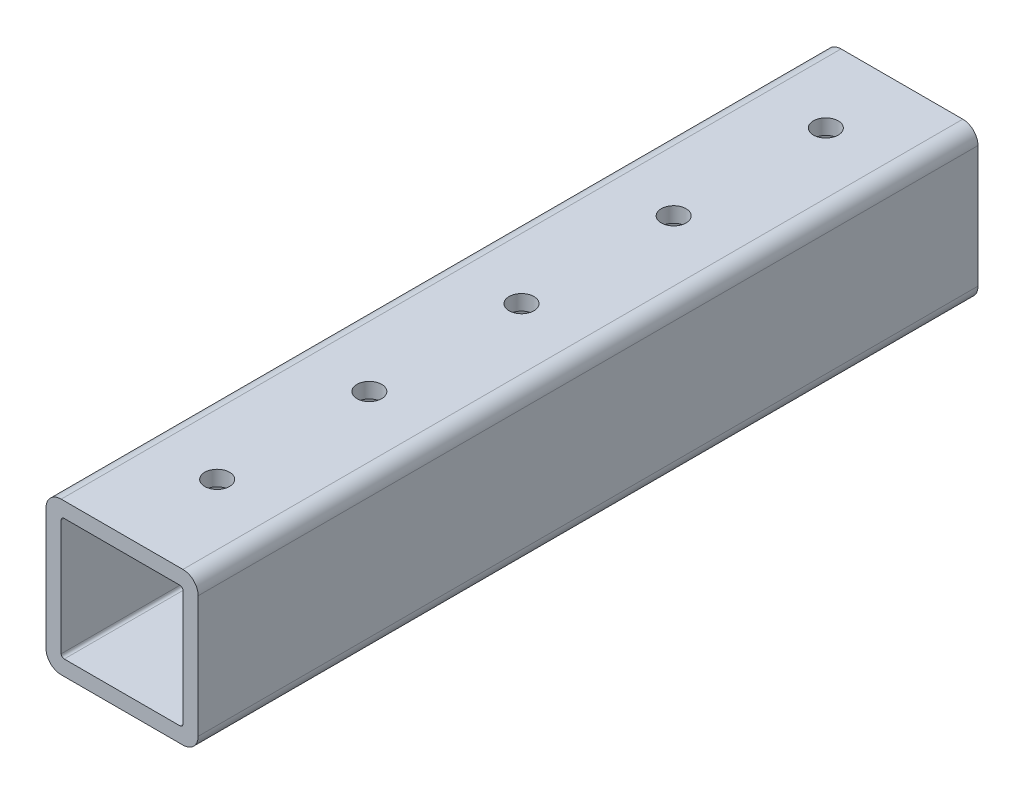
ISO-10303-21;
HEADER;
FILE_DESCRIPTION(('STEP AP214'),'2;1');
FILE_NAME('part.step','',(''),(''),'','','');
FILE_SCHEMA(('AUTOMOTIVE_DESIGN { 1 0 10303 214 1 1 1 1 }'));
ENDSEC;
DATA;
#1=APPLICATION_CONTEXT('core data for automotive mechanical design processes');
#2=APPLICATION_PROTOCOL_DEFINITION('international standard','automotive_design',2000,#1);
#3=PRODUCT_CONTEXT('',#1,'mechanical');
#4=PRODUCT('Part','Part','',(#3));
#5=PRODUCT_RELATED_PRODUCT_CATEGORY('part','',(#4));
#6=PRODUCT_DEFINITION_FORMATION('','',#4);
#7=PRODUCT_DEFINITION_CONTEXT('part definition',#1,'design');
#8=PRODUCT_DEFINITION('design','',#6,#7);
#9=PRODUCT_DEFINITION_SHAPE('','',#8);
#10=(LENGTH_UNIT() NAMED_UNIT(*) SI_UNIT(.MILLI.,.METRE.));
#11=(NAMED_UNIT(*) PLANE_ANGLE_UNIT() SI_UNIT($,.RADIAN.));
#12=(NAMED_UNIT(*) SI_UNIT($,.STERADIAN.) SOLID_ANGLE_UNIT());
#13=UNCERTAINTY_MEASURE_WITH_UNIT(LENGTH_MEASURE(1.E-05),#10,'distance_accuracy_value','');
#14=(GEOMETRIC_REPRESENTATION_CONTEXT(3) GLOBAL_UNCERTAINTY_ASSIGNED_CONTEXT((#13)) GLOBAL_UNIT_ASSIGNED_CONTEXT((#10,
#11,#12)) REPRESENTATION_CONTEXT('',''));
#15=CARTESIAN_POINT('',(0.,0.,0.));
#16=DIRECTION('',(0.,0.,1.));
#17=DIRECTION('',(1.,0.,0.));
#18=AXIS2_PLACEMENT_3D('',#15,#16,#17);
#19=CARTESIAN_POINT('',(0.,0.,269.875000000006));
#20=DIRECTION('',(0.,0.,1.));
#21=DIRECTION('',(1.,0.,0.));
#22=AXIS2_PLACEMENT_3D('',#19,#20,#21);
#23=PLANE('',#22);
#24=DIRECTION('',(-1.,0.,0.));
#25=VECTOR('',#24,1.);
#26=CARTESIAN_POINT('',(-10.16,10.16,269.875000000006));
#27=LINE('',#26,#25);
#28=CARTESIAN_POINT('',(9.66,10.16,269.875000000006));
#29=VERTEX_POINT('',#28);
#30=CARTESIAN_POINT('',(-9.65999999999999,10.16,269.875000000006));
#31=VERTEX_POINT('',#30);
#32=EDGE_CURVE('E206',#29,#31,#27,.T.);
#33=ORIENTED_EDGE('',*,*,#32,.F.);
#34=CARTESIAN_POINT('',(9.66,9.65999999999999,269.875000000006));
#35=DIRECTION('',(0.,0.,1.));
#36=DIRECTION('',(1.,0.,0.));
#37=AXIS2_PLACEMENT_3D('',#34,#35,#36);
#38=CIRCLE('',#37,0.5);
#39=CARTESIAN_POINT('',(10.16,9.65999999999999,269.875000000006));
#40=VERTEX_POINT('',#39);
#41=EDGE_CURVE('E202',#29,#40,#38,.F.);
#42=ORIENTED_EDGE('',*,*,#41,.T.);
#43=DIRECTION('',(0.,1.,0.));
#44=VECTOR('',#43,1.);
#45=CARTESIAN_POINT('',(10.16,-10.16,269.875000000006));
#46=LINE('',#45,#44);
#47=CARTESIAN_POINT('',(10.16,-9.66,269.875000000006));
#48=VERTEX_POINT('',#47);
#49=EDGE_CURVE('E195',#48,#40,#46,.T.);
#50=ORIENTED_EDGE('',*,*,#49,.F.);
#51=CARTESIAN_POINT('',(9.66,-9.66,269.875000000006));
#52=DIRECTION('',(0.,0.,1.));
#53=DIRECTION('',(1.,0.,0.));
#54=AXIS2_PLACEMENT_3D('',#51,#52,#53);
#55=CIRCLE('',#54,0.5);
#56=CARTESIAN_POINT('',(9.66,-10.16,269.875000000006));
#57=VERTEX_POINT('',#56);
#58=EDGE_CURVE('E191',#48,#57,#55,.F.);
#59=ORIENTED_EDGE('',*,*,#58,.T.);
#60=DIRECTION('',(1.,0.,0.));
#61=VECTOR('',#60,1.);
#62=CARTESIAN_POINT('',(-10.16,-10.16,269.875000000006));
#63=LINE('',#62,#61);
#64=CARTESIAN_POINT('',(-9.65999999999999,-10.16,269.875000000006));
#65=VERTEX_POINT('',#64);
#66=EDGE_CURVE('E187',#65,#57,#63,.T.);
#67=ORIENTED_EDGE('',*,*,#66,.F.);
#68=CARTESIAN_POINT('',(-9.65999999999999,-9.66,269.875000000006));
#69=DIRECTION('',(0.,0.,1.));
#70=DIRECTION('',(1.,0.,0.));
#71=AXIS2_PLACEMENT_3D('',#68,#69,#70);
#72=CIRCLE('',#71,0.5);
#73=CARTESIAN_POINT('',(-10.16,-9.66,269.875000000006));
#74=VERTEX_POINT('',#73);
#75=EDGE_CURVE('E193',#65,#74,#72,.F.);
#76=ORIENTED_EDGE('',*,*,#75,.T.);
#77=DIRECTION('',(0.,-1.,0.));
#78=VECTOR('',#77,1.);
#79=CARTESIAN_POINT('',(-10.16,-10.16,269.875000000006));
#80=LINE('',#79,#78);
#81=CARTESIAN_POINT('',(-10.16,9.66,269.875000000006));
#82=VERTEX_POINT('',#81);
#83=EDGE_CURVE('E198',#82,#74,#80,.T.);
#84=ORIENTED_EDGE('',*,*,#83,.F.);
#85=CARTESIAN_POINT('',(-9.65999999999999,9.66,269.875000000006));
#86=DIRECTION('',(0.,0.,1.));
#87=DIRECTION('',(1.,0.,0.));
#88=AXIS2_PLACEMENT_3D('',#85,#86,#87);
#89=CIRCLE('',#88,0.5);
#90=EDGE_CURVE('E204',#82,#31,#89,.F.);
#91=ORIENTED_EDGE('',*,*,#90,.T.);
#92=EDGE_LOOP('',(#33,#42,#50,#59,#67,#76,#84,#91));
#93=FACE_BOUND('',#92,.T.);
#94=CARTESIAN_POINT('',(10.16,10.16,269.875000000006));
#95=DIRECTION('',(0.,0.,1.));
#96=DIRECTION('',(1.,0.,0.));
#97=AXIS2_PLACEMENT_3D('',#94,#95,#96);
#98=CIRCLE('',#97,2.54);
#99=CARTESIAN_POINT('',(10.16,12.7,269.875000000006));
#100=VERTEX_POINT('',#99);
#101=CARTESIAN_POINT('',(12.7,10.16,269.875000000006));
#102=VERTEX_POINT('',#101);
#103=EDGE_CURVE('E163',#100,#102,#98,.F.);
#104=ORIENTED_EDGE('',*,*,#103,.F.);
#105=DIRECTION('',(-1.,0.,0.));
#106=VECTOR('',#105,1.);
#107=CARTESIAN_POINT('',(-10.16,12.7,269.875000000006));
#108=LINE('',#107,#106);
#109=CARTESIAN_POINT('',(-10.16,12.7,269.875000000006));
#110=VERTEX_POINT('',#109);
#111=EDGE_CURVE('E184',#100,#110,#108,.T.);
#112=ORIENTED_EDGE('',*,*,#111,.T.);
#113=CARTESIAN_POINT('',(-10.16,10.16,269.875000000006));
#114=DIRECTION('',(0.,0.,1.));
#115=DIRECTION('',(1.,0.,0.));
#116=AXIS2_PLACEMENT_3D('',#113,#114,#115);
#117=CIRCLE('',#116,2.54);
#118=CARTESIAN_POINT('',(-12.7,10.16,269.875000000006));
#119=VERTEX_POINT('',#118);
#120=EDGE_CURVE('E52',#119,#110,#117,.F.);
#121=ORIENTED_EDGE('',*,*,#120,.F.);
#122=DIRECTION('',(0.,-1.,0.));
#123=VECTOR('',#122,1.);
#124=CARTESIAN_POINT('',(-12.7,-10.16,269.875000000006));
#125=LINE('',#124,#123);
#126=CARTESIAN_POINT('',(-12.7,-10.16,269.875000000006));
#127=VERTEX_POINT('',#126);
#128=EDGE_CURVE('E60',#119,#127,#125,.T.);
#129=ORIENTED_EDGE('',*,*,#128,.T.);
#130=CARTESIAN_POINT('',(-10.16,-10.16,269.875000000006));
#131=DIRECTION('',(0.,0.,1.));
#132=DIRECTION('',(1.,0.,0.));
#133=AXIS2_PLACEMENT_3D('',#130,#131,#132);
#134=CIRCLE('',#133,2.54);
#135=CARTESIAN_POINT('',(-10.16,-12.7,269.875000000006));
#136=VERTEX_POINT('',#135);
#137=EDGE_CURVE('E178',#136,#127,#134,.F.);
#138=ORIENTED_EDGE('',*,*,#137,.F.);
#139=DIRECTION('',(1.,0.,0.));
#140=VECTOR('',#139,1.);
#141=CARTESIAN_POINT('',(-10.16,-12.7,269.875000000006));
#142=LINE('',#141,#140);
#143=CARTESIAN_POINT('',(10.16,-12.7,269.875000000006));
#144=VERTEX_POINT('',#143);
#145=EDGE_CURVE('E174',#136,#144,#142,.T.);
#146=ORIENTED_EDGE('',*,*,#145,.T.);
#147=CARTESIAN_POINT('',(10.16,-10.16,269.875000000006));
#148=DIRECTION('',(0.,0.,1.));
#149=DIRECTION('',(1.,0.,0.));
#150=AXIS2_PLACEMENT_3D('',#147,#148,#149);
#151=CIRCLE('',#150,2.54);
#152=CARTESIAN_POINT('',(12.7,-10.16,269.875000000006));
#153=VERTEX_POINT('',#152);
#154=EDGE_CURVE('E169',#153,#144,#151,.F.);
#155=ORIENTED_EDGE('',*,*,#154,.F.);
#156=DIRECTION('',(0.,1.,0.));
#157=VECTOR('',#156,1.);
#158=CARTESIAN_POINT('',(12.7,-10.16,269.875000000006));
#159=LINE('',#158,#157);
#160=EDGE_CURVE('E12',#153,#102,#159,.T.);
#161=ORIENTED_EDGE('',*,*,#160,.T.);
#162=EDGE_LOOP('',(#104,#112,#121,#129,#138,#146,#155,#161));
#163=FACE_BOUND('',#162,.T.);
#164=ADVANCED_FACE('F37',(#93,#163),#23,.T.);
#165=CARTESIAN_POINT('',(-9.65999999999999,9.66,749.3));
#166=DIRECTION('',(0.,0.,1.));
#167=DIRECTION('',(1.,0.,0.));
#168=AXIS2_PLACEMENT_3D('',#165,#166,#167);
#169=CYLINDRICAL_SURFACE('',#168,0.5);
#170=ORIENTED_EDGE('',*,*,#90,.F.);
#171=DIRECTION('',(0.,0.,-1.));
#172=VECTOR('',#171,1.);
#173=CARTESIAN_POINT('',(-10.16,9.66,749.3));
#174=LINE('',#173,#172);
#175=CARTESIAN_POINT('',(-10.16,9.66,139.7));
#176=VERTEX_POINT('',#175);
#177=EDGE_CURVE('E264',#176,#82,#174,.F.);
#178=ORIENTED_EDGE('',*,*,#177,.F.);
#179=CARTESIAN_POINT('',(-9.65999999999999,9.66,139.7));
#180=DIRECTION('',(0.,0.,-1.));
#181=DIRECTION('',(-1.,0.,0.));
#182=AXIS2_PLACEMENT_3D('',#179,#180,#181);
#183=CIRCLE('',#182,0.5);
#184=CARTESIAN_POINT('',(-9.65999999999999,10.16,139.7));
#185=VERTEX_POINT('',#184);
#186=EDGE_CURVE('E243',#185,#176,#183,.F.);
#187=ORIENTED_EDGE('',*,*,#186,.F.);
#188=DIRECTION('',(0.,0.,-1.));
#189=VECTOR('',#188,1.);
#190=CARTESIAN_POINT('',(-9.65999999999999,10.16,749.3));
#191=LINE('',#190,#189);
#192=EDGE_CURVE('E315',#31,#185,#191,.T.);
#193=ORIENTED_EDGE('',*,*,#192,.F.);
#194=EDGE_LOOP('',(#170,#178,#187,#193));
#195=FACE_BOUND('',#194,.T.);
#196=ADVANCED_FACE('F39',(#195),#169,.F.);
#197=CARTESIAN_POINT('',(9.66,9.65999999999999,749.3));
#198=DIRECTION('',(0.,0.,1.));
#199=DIRECTION('',(1.,0.,0.));
#200=AXIS2_PLACEMENT_3D('',#197,#198,#199);
#201=CYLINDRICAL_SURFACE('',#200,0.5);
#202=ORIENTED_EDGE('',*,*,#41,.F.);
#203=DIRECTION('',(0.,0.,-1.));
#204=VECTOR('',#203,1.);
#205=CARTESIAN_POINT('',(9.66,10.16,749.3));
#206=LINE('',#205,#204);
#207=CARTESIAN_POINT('',(9.66,10.16,139.7));
#208=VERTEX_POINT('',#207);
#209=EDGE_CURVE('E263',#208,#29,#206,.F.);
#210=ORIENTED_EDGE('',*,*,#209,.F.);
#211=CARTESIAN_POINT('',(9.66,9.65999999999999,139.7));
#212=DIRECTION('',(0.,0.,-1.));
#213=DIRECTION('',(-1.,0.,0.));
#214=AXIS2_PLACEMENT_3D('',#211,#212,#213);
#215=CIRCLE('',#214,0.5);
#216=CARTESIAN_POINT('',(10.16,9.65999999999999,139.7));
#217=VERTEX_POINT('',#216);
#218=EDGE_CURVE('E241',#217,#208,#215,.F.);
#219=ORIENTED_EDGE('',*,*,#218,.F.);
#220=DIRECTION('',(0.,0.,1.));
#221=VECTOR('',#220,1.);
#222=CARTESIAN_POINT('',(10.16,9.65999999999999,749.3));
#223=LINE('',#222,#221);
#224=EDGE_CURVE('E252',#40,#217,#223,.F.);
#225=ORIENTED_EDGE('',*,*,#224,.F.);
#226=EDGE_LOOP('',(#202,#210,#219,#225));
#227=FACE_BOUND('',#226,.T.);
#228=ADVANCED_FACE('F388',(#227),#201,.F.);
#229=CARTESIAN_POINT('',(-9.65999999999999,-9.66,749.3));
#230=DIRECTION('',(0.,0.,1.));
#231=DIRECTION('',(1.,0.,0.));
#232=AXIS2_PLACEMENT_3D('',#229,#230,#231);
#233=CYLINDRICAL_SURFACE('',#232,0.5);
#234=ORIENTED_EDGE('',*,*,#75,.F.);
#235=DIRECTION('',(0.,0.,1.));
#236=VECTOR('',#235,1.);
#237=CARTESIAN_POINT('',(-9.65999999999999,-10.16,749.3));
#238=LINE('',#237,#236);
#239=CARTESIAN_POINT('',(-9.65999999999999,-10.16,139.7));
#240=VERTEX_POINT('',#239);
#241=EDGE_CURVE('E259',#240,#65,#238,.T.);
#242=ORIENTED_EDGE('',*,*,#241,.F.);
#243=CARTESIAN_POINT('',(-9.65999999999999,-9.66,139.7));
#244=DIRECTION('',(0.,0.,-1.));
#245=DIRECTION('',(-1.,0.,0.));
#246=AXIS2_PLACEMENT_3D('',#243,#244,#245);
#247=CIRCLE('',#246,0.5);
#248=CARTESIAN_POINT('',(-10.16,-9.66,139.7));
#249=VERTEX_POINT('',#248);
#250=EDGE_CURVE('E233',#249,#240,#247,.F.);
#251=ORIENTED_EDGE('',*,*,#250,.F.);
#252=DIRECTION('',(0.,0.,-1.));
#253=VECTOR('',#252,1.);
#254=CARTESIAN_POINT('',(-10.16,-9.66,749.3));
#255=LINE('',#254,#253);
#256=EDGE_CURVE('E260',#74,#249,#255,.T.);
#257=ORIENTED_EDGE('',*,*,#256,.F.);
#258=EDGE_LOOP('',(#234,#242,#251,#257));
#259=FACE_BOUND('',#258,.T.);
#260=ADVANCED_FACE('F628',(#259),#233,.F.);
#261=CARTESIAN_POINT('',(9.66,-9.66,749.3));
#262=DIRECTION('',(0.,0.,1.));
#263=DIRECTION('',(1.,0.,0.));
#264=AXIS2_PLACEMENT_3D('',#261,#262,#263);
#265=CYLINDRICAL_SURFACE('',#264,0.5);
#266=ORIENTED_EDGE('',*,*,#58,.F.);
#267=DIRECTION('',(0.,0.,1.));
#268=VECTOR('',#267,1.);
#269=CARTESIAN_POINT('',(10.16,-9.66,749.3));
#270=LINE('',#269,#268);
#271=CARTESIAN_POINT('',(10.16,-9.66,139.7));
#272=VERTEX_POINT('',#271);
#273=EDGE_CURVE('E254',#272,#48,#270,.T.);
#274=ORIENTED_EDGE('',*,*,#273,.F.);
#275=CARTESIAN_POINT('',(9.66,-9.66,139.7));
#276=DIRECTION('',(0.,0.,-1.));
#277=DIRECTION('',(-1.,0.,0.));
#278=AXIS2_PLACEMENT_3D('',#275,#276,#277);
#279=CIRCLE('',#278,0.5);
#280=CARTESIAN_POINT('',(9.66,-10.16,139.7));
#281=VERTEX_POINT('',#280);
#282=EDGE_CURVE('E231',#281,#272,#279,.F.);
#283=ORIENTED_EDGE('',*,*,#282,.F.);
#284=DIRECTION('',(0.,0.,1.));
#285=VECTOR('',#284,1.);
#286=CARTESIAN_POINT('',(9.66,-10.16,749.3));
#287=LINE('',#286,#285);
#288=EDGE_CURVE('E295',#57,#281,#287,.F.);
#289=ORIENTED_EDGE('',*,*,#288,.F.);
#290=EDGE_LOOP('',(#266,#274,#283,#289));
#291=FACE_BOUND('',#290,.T.);
#292=ADVANCED_FACE('F419',(#291),#265,.F.);
#293=CARTESIAN_POINT('',(-10.16,12.7,749.3));
#294=DIRECTION('',(0.,-1.,0.));
#295=DIRECTION('',(0.,0.,-1.));
#296=AXIS2_PLACEMENT_3D('',#293,#294,#295);
#297=PLANE('',#296);
#298=CARTESIAN_POINT('',(0.,12.7,254.));
#299=DIRECTION('',(0.,1.,0.));
#300=DIRECTION('',(0.,0.,1.));
#301=AXIS2_PLACEMENT_3D('',#298,#299,#300);
#302=CIRCLE('',#301,2.07009999999996);
#303=CARTESIAN_POINT('',(0.,12.7,256.0701));
#304=VERTEX_POINT('',#303);
#305=EDGE_CURVE('E338',#304,#304,#302,.T.);
#306=ORIENTED_EDGE('',*,*,#305,.F.);
#307=EDGE_LOOP('',(#306));
#308=FACE_BOUND('',#307,.T.);
#309=CARTESIAN_POINT('',(0.,12.7,228.6));
#310=DIRECTION('',(0.,1.,0.));
#311=DIRECTION('',(0.,0.,1.));
#312=AXIS2_PLACEMENT_3D('',#309,#310,#311);
#313=CIRCLE('',#312,2.07009999999996);
#314=CARTESIAN_POINT('',(0.,12.7,230.6701));
#315=VERTEX_POINT('',#314);
#316=EDGE_CURVE('E341',#315,#315,#313,.T.);
#317=ORIENTED_EDGE('',*,*,#316,.F.);
#318=EDGE_LOOP('',(#317));
#319=FACE_BOUND('',#318,.T.);
#320=CARTESIAN_POINT('',(0.,12.7,203.2));
#321=DIRECTION('',(0.,1.,0.));
#322=DIRECTION('',(0.,0.,1.));
#323=AXIS2_PLACEMENT_3D('',#320,#321,#322);
#324=CIRCLE('',#323,2.07009999999996);
#325=CARTESIAN_POINT('',(0.,12.7,205.2701));
#326=VERTEX_POINT('',#325);
#327=EDGE_CURVE('E344',#326,#326,#324,.T.);
#328=ORIENTED_EDGE('',*,*,#327,.F.);
#329=EDGE_LOOP('',(#328));
#330=FACE_BOUND('',#329,.T.);
#331=CARTESIAN_POINT('',(0.,12.7,177.8));
#332=DIRECTION('',(0.,1.,0.));
#333=DIRECTION('',(0.,0.,1.));
#334=AXIS2_PLACEMENT_3D('',#331,#332,#333);
#335=CIRCLE('',#334,2.07009999999996);
#336=CARTESIAN_POINT('',(0.,12.7,179.8701));
#337=VERTEX_POINT('',#336);
#338=EDGE_CURVE('E348',#337,#337,#335,.T.);
#339=ORIENTED_EDGE('',*,*,#338,.F.);
#340=EDGE_LOOP('',(#339));
#341=FACE_BOUND('',#340,.T.);
#342=CARTESIAN_POINT('',(0.,12.7,152.4));
#343=DIRECTION('',(0.,1.,0.));
#344=DIRECTION('',(0.,0.,1.));
#345=AXIS2_PLACEMENT_3D('',#342,#343,#344);
#346=CIRCLE('',#345,2.07009999999996);
#347=CARTESIAN_POINT('',(0.,12.7,154.4701));
#348=VERTEX_POINT('',#347);
#349=EDGE_CURVE('E248',#348,#348,#346,.T.);
#350=ORIENTED_EDGE('',*,*,#349,.F.);
#351=EDGE_LOOP('',(#350));
#352=FACE_BOUND('',#351,.T.);
#353=ORIENTED_EDGE('',*,*,#111,.F.);
#354=DIRECTION('',(0.,0.,-1.));
#355=VECTOR('',#354,1.);
#356=CARTESIAN_POINT('',(10.16,12.7,749.3));
#357=LINE('',#356,#355);
#358=CARTESIAN_POINT('',(10.16,12.7,139.7));
#359=VERTEX_POINT('',#358);
#360=EDGE_CURVE('E166',#359,#100,#357,.F.);
#361=ORIENTED_EDGE('',*,*,#360,.F.);
#362=DIRECTION('',(1.,0.,0.));
#363=VECTOR('',#362,1.);
#364=CARTESIAN_POINT('',(-10.16,12.7,139.7));
#365=LINE('',#364,#363);
#366=CARTESIAN_POINT('',(-10.16,12.7,139.7));
#367=VERTEX_POINT('',#366);
#368=EDGE_CURVE('E225',#367,#359,#365,.T.);
#369=ORIENTED_EDGE('',*,*,#368,.F.);
#370=DIRECTION('',(0.,0.,-1.));
#371=VECTOR('',#370,1.);
#372=CARTESIAN_POINT('',(-10.16,12.7,749.3));
#373=LINE('',#372,#371);
#374=EDGE_CURVE('E275',#110,#367,#373,.T.);
#375=ORIENTED_EDGE('',*,*,#374,.F.);
#376=EDGE_LOOP('',(#353,#361,#369,#375));
#377=FACE_BOUND('',#376,.T.);
#378=ADVANCED_FACE('F358',(#308,#319,#330,#341,#352,#377),#297,.F.);
#379=CARTESIAN_POINT('',(-10.16,10.16,749.3));
#380=DIRECTION('',(0.,0.,-1.));
#381=DIRECTION('',(-1.,0.,0.));
#382=AXIS2_PLACEMENT_3D('',#379,#380,#381);
#383=CYLINDRICAL_SURFACE('',#382,2.54);
#384=DIRECTION('',(0.,0.,-1.));
#385=VECTOR('',#384,1.);
#386=CARTESIAN_POINT('',(-12.7,10.16,749.3));
#387=LINE('',#386,#385);
#388=CARTESIAN_POINT('',(-12.7,10.16,139.7));
#389=VERTEX_POINT('',#388);
#390=EDGE_CURVE('E272',#389,#119,#387,.F.);
#391=ORIENTED_EDGE('',*,*,#390,.T.);
#392=ORIENTED_EDGE('',*,*,#120,.T.);
#393=ORIENTED_EDGE('',*,*,#374,.T.);
#394=CARTESIAN_POINT('',(-10.16,10.16,139.7));
#395=DIRECTION('',(0.,0.,-1.));
#396=DIRECTION('',(-1.,0.,0.));
#397=AXIS2_PLACEMENT_3D('',#394,#395,#396);
#398=CIRCLE('',#397,2.54);
#399=EDGE_CURVE('E223',#367,#389,#398,.F.);
#400=ORIENTED_EDGE('',*,*,#399,.T.);
#401=EDGE_LOOP('',(#391,#392,#393,#400));
#402=FACE_BOUND('',#401,.T.);
#403=ADVANCED_FACE('F409',(#402),#383,.T.);
#404=CARTESIAN_POINT('',(-12.7,-10.16,749.3));
#405=DIRECTION('',(1.,0.,0.));
#406=DIRECTION('',(0.,0.,-1.));
#407=AXIS2_PLACEMENT_3D('',#404,#405,#406);
#408=PLANE('',#407);
#409=ORIENTED_EDGE('',*,*,#128,.F.);
#410=ORIENTED_EDGE('',*,*,#390,.F.);
#411=DIRECTION('',(0.,1.,0.));
#412=VECTOR('',#411,1.);
#413=CARTESIAN_POINT('',(-12.7,-10.16,139.7));
#414=LINE('',#413,#412);
#415=CARTESIAN_POINT('',(-12.7,-10.16,139.7));
#416=VERTEX_POINT('',#415);
#417=EDGE_CURVE('E219',#416,#389,#414,.T.);
#418=ORIENTED_EDGE('',*,*,#417,.F.);
#419=DIRECTION('',(0.,0.,-1.));
#420=VECTOR('',#419,1.);
#421=CARTESIAN_POINT('',(-12.7,-10.16,749.3));
#422=LINE('',#421,#420);
#423=EDGE_CURVE('E268',#127,#416,#422,.T.);
#424=ORIENTED_EDGE('',*,*,#423,.F.);
#425=EDGE_LOOP('',(#409,#410,#418,#424));
#426=FACE_BOUND('',#425,.T.);
#427=ADVANCED_FACE('F363',(#426),#408,.F.);
#428=CARTESIAN_POINT('',(-10.16,-10.16,749.3));
#429=DIRECTION('',(0.,0.,-1.));
#430=DIRECTION('',(-1.,0.,0.));
#431=AXIS2_PLACEMENT_3D('',#428,#429,#430);
#432=CYLINDRICAL_SURFACE('',#431,2.54);
#433=DIRECTION('',(0.,0.,-1.));
#434=VECTOR('',#433,1.);
#435=CARTESIAN_POINT('',(-10.16,-12.7,749.3));
#436=LINE('',#435,#434);
#437=CARTESIAN_POINT('',(-10.16,-12.7,139.7));
#438=VERTEX_POINT('',#437);
#439=EDGE_CURVE('E271',#438,#136,#436,.F.);
#440=ORIENTED_EDGE('',*,*,#439,.T.);
#441=ORIENTED_EDGE('',*,*,#137,.T.);
#442=ORIENTED_EDGE('',*,*,#423,.T.);
#443=CARTESIAN_POINT('',(-10.16,-10.16,139.7));
#444=DIRECTION('',(0.,0.,-1.));
#445=DIRECTION('',(-1.,0.,0.));
#446=AXIS2_PLACEMENT_3D('',#443,#444,#445);
#447=CIRCLE('',#446,2.54);
#448=EDGE_CURVE('E217',#416,#438,#447,.F.);
#449=ORIENTED_EDGE('',*,*,#448,.T.);
#450=EDGE_LOOP('',(#440,#441,#442,#449));
#451=FACE_BOUND('',#450,.T.);
#452=ADVANCED_FACE('F360',(#451),#432,.T.);
#453=CARTESIAN_POINT('',(-10.16,-12.7,749.3));
#454=DIRECTION('',(0.,1.,0.));
#455=DIRECTION('',(0.,0.,1.));
#456=AXIS2_PLACEMENT_3D('',#453,#454,#455);
#457=PLANE('',#456);
#458=CARTESIAN_POINT('',(0.,-12.7,254.));
#459=DIRECTION('',(0.,1.,0.));
#460=DIRECTION('',(0.,0.,1.));
#461=AXIS2_PLACEMENT_3D('',#458,#459,#460);
#462=CIRCLE('',#461,2.07009999999996);
#463=CARTESIAN_POINT('',(0.,-12.7,256.0701));
#464=VERTEX_POINT('',#463);
#465=EDGE_CURVE('E267',#464,#464,#462,.F.);
#466=ORIENTED_EDGE('',*,*,#465,.F.);
#467=EDGE_LOOP('',(#466));
#468=FACE_BOUND('',#467,.T.);
#469=CARTESIAN_POINT('',(0.,-12.7,228.6));
#470=DIRECTION('',(0.,1.,0.));
#471=DIRECTION('',(0.,0.,1.));
#472=AXIS2_PLACEMENT_3D('',#469,#470,#471);
#473=CIRCLE('',#472,2.07009999999996);
#474=CARTESIAN_POINT('',(0.,-12.7,230.6701));
#475=VERTEX_POINT('',#474);
#476=EDGE_CURVE('E321',#475,#475,#473,.F.);
#477=ORIENTED_EDGE('',*,*,#476,.F.);
#478=EDGE_LOOP('',(#477));
#479=FACE_BOUND('',#478,.T.);
#480=CARTESIAN_POINT('',(0.,-12.7,203.2));
#481=DIRECTION('',(0.,1.,0.));
#482=DIRECTION('',(0.,0.,1.));
#483=AXIS2_PLACEMENT_3D('',#480,#481,#482);
#484=CIRCLE('',#483,2.07009999999996);
#485=CARTESIAN_POINT('',(0.,-12.7,205.2701));
#486=VERTEX_POINT('',#485);
#487=EDGE_CURVE('E324',#486,#486,#484,.F.);
#488=ORIENTED_EDGE('',*,*,#487,.F.);
#489=EDGE_LOOP('',(#488));
#490=FACE_BOUND('',#489,.T.);
#491=CARTESIAN_POINT('',(0.,-12.7,177.8));
#492=DIRECTION('',(0.,1.,0.));
#493=DIRECTION('',(0.,0.,1.));
#494=AXIS2_PLACEMENT_3D('',#491,#492,#493);
#495=CIRCLE('',#494,2.07009999999996);
#496=CARTESIAN_POINT('',(0.,-12.7,179.8701));
#497=VERTEX_POINT('',#496);
#498=EDGE_CURVE('E327',#497,#497,#495,.F.);
#499=ORIENTED_EDGE('',*,*,#498,.F.);
#500=EDGE_LOOP('',(#499));
#501=FACE_BOUND('',#500,.T.);
#502=CARTESIAN_POINT('',(0.,-12.7,152.4));
#503=DIRECTION('',(0.,1.,0.));
#504=DIRECTION('',(0.,0.,1.));
#505=AXIS2_PLACEMENT_3D('',#502,#503,#504);
#506=CIRCLE('',#505,2.07009999999996);
#507=CARTESIAN_POINT('',(0.,-12.7,154.4701));
#508=VERTEX_POINT('',#507);
#509=EDGE_CURVE('E330',#508,#508,#506,.F.);
#510=ORIENTED_EDGE('',*,*,#509,.F.);
#511=EDGE_LOOP('',(#510));
#512=FACE_BOUND('',#511,.T.);
#513=ORIENTED_EDGE('',*,*,#145,.F.);
#514=ORIENTED_EDGE('',*,*,#439,.F.);
#515=DIRECTION('',(-1.,0.,0.));
#516=VECTOR('',#515,1.);
#517=CARTESIAN_POINT('',(-10.16,-12.7,139.7));
#518=LINE('',#517,#516);
#519=CARTESIAN_POINT('',(10.16,-12.7,139.7));
#520=VERTEX_POINT('',#519);
#521=EDGE_CURVE('E214',#520,#438,#518,.T.);
#522=ORIENTED_EDGE('',*,*,#521,.F.);
#523=DIRECTION('',(0.,0.,-1.));
#524=VECTOR('',#523,1.);
#525=CARTESIAN_POINT('',(10.16,-12.7,749.3));
#526=LINE('',#525,#524);
#527=EDGE_CURVE('E278',#144,#520,#526,.T.);
#528=ORIENTED_EDGE('',*,*,#527,.F.);
#529=EDGE_LOOP('',(#513,#514,#522,#528));
#530=FACE_BOUND('',#529,.T.);
#531=ADVANCED_FACE('F367',(#468,#479,#490,#501,#512,#530),#457,.F.);
#532=CARTESIAN_POINT('',(-10.16,-10.16,749.3));
#533=DIRECTION('',(1.,0.,0.));
#534=DIRECTION('',(0.,0.,-1.));
#535=AXIS2_PLACEMENT_3D('',#532,#533,#534);
#536=PLANE('',#535);
#537=ORIENTED_EDGE('',*,*,#177,.T.);
#538=ORIENTED_EDGE('',*,*,#83,.T.);
#539=ORIENTED_EDGE('',*,*,#256,.T.);
#540=DIRECTION('',(0.,1.,0.));
#541=VECTOR('',#540,1.);
#542=CARTESIAN_POINT('',(-10.16,-10.16,139.7));
#543=LINE('',#542,#541);
#544=EDGE_CURVE('E238',#249,#176,#543,.T.);
#545=ORIENTED_EDGE('',*,*,#544,.T.);
#546=EDGE_LOOP('',(#537,#538,#539,#545));
#547=FACE_BOUND('',#546,.T.);
#548=ADVANCED_FACE('F475',(#547),#536,.T.);
#549=CARTESIAN_POINT('',(-10.16,10.16,749.3));
#550=DIRECTION('',(0.,-1.,0.));
#551=DIRECTION('',(0.,0.,-1.));
#552=AXIS2_PLACEMENT_3D('',#549,#550,#551);
#553=PLANE('',#552);
#554=CARTESIAN_POINT('',(0.,10.16,254.));
#555=DIRECTION('',(0.,1.,0.));
#556=DIRECTION('',(0.,0.,1.));
#557=AXIS2_PLACEMENT_3D('',#554,#555,#556);
#558=CIRCLE('',#557,2.07009999999996);
#559=CARTESIAN_POINT('',(0.,10.16,256.0701));
#560=VERTEX_POINT('',#559);
#561=EDGE_CURVE('E255',#560,#560,#558,.T.);
#562=ORIENTED_EDGE('',*,*,#561,.T.);
#563=EDGE_LOOP('',(#562));
#564=FACE_BOUND('',#563,.T.);
#565=CARTESIAN_POINT('',(0.,10.16,228.6));
#566=DIRECTION('',(0.,1.,0.));
#567=DIRECTION('',(0.,0.,1.));
#568=AXIS2_PLACEMENT_3D('',#565,#566,#567);
#569=CIRCLE('',#568,2.07009999999996);
#570=CARTESIAN_POINT('',(0.,10.16,230.6701));
#571=VERTEX_POINT('',#570);
#572=EDGE_CURVE('E303',#571,#571,#569,.T.);
#573=ORIENTED_EDGE('',*,*,#572,.T.);
#574=EDGE_LOOP('',(#573));
#575=FACE_BOUND('',#574,.T.);
#576=CARTESIAN_POINT('',(0.,10.16,203.2));
#577=DIRECTION('',(0.,1.,0.));
#578=DIRECTION('',(0.,0.,1.));
#579=AXIS2_PLACEMENT_3D('',#576,#577,#578);
#580=CIRCLE('',#579,2.07009999999996);
#581=CARTESIAN_POINT('',(0.,10.16,205.2701));
#582=VERTEX_POINT('',#581);
#583=EDGE_CURVE('E306',#582,#582,#580,.T.);
#584=ORIENTED_EDGE('',*,*,#583,.T.);
#585=EDGE_LOOP('',(#584));
#586=FACE_BOUND('',#585,.T.);
#587=CARTESIAN_POINT('',(0.,10.16,177.8));
#588=DIRECTION('',(0.,1.,0.));
#589=DIRECTION('',(0.,0.,1.));
#590=AXIS2_PLACEMENT_3D('',#587,#588,#589);
#591=CIRCLE('',#590,2.07009999999996);
#592=CARTESIAN_POINT('',(0.,10.16,179.8701));
#593=VERTEX_POINT('',#592);
#594=EDGE_CURVE('E309',#593,#593,#591,.T.);
#595=ORIENTED_EDGE('',*,*,#594,.T.);
#596=EDGE_LOOP('',(#595));
#597=FACE_BOUND('',#596,.T.);
#598=CARTESIAN_POINT('',(0.,10.16,152.4));
#599=DIRECTION('',(0.,1.,0.));
#600=DIRECTION('',(0.,0.,1.));
#601=AXIS2_PLACEMENT_3D('',#598,#599,#600);
#602=CIRCLE('',#601,2.07009999999996);
#603=CARTESIAN_POINT('',(0.,10.16,154.4701));
#604=VERTEX_POINT('',#603);
#605=EDGE_CURVE('E312',#604,#604,#602,.T.);
#606=ORIENTED_EDGE('',*,*,#605,.T.);
#607=EDGE_LOOP('',(#606));
#608=FACE_BOUND('',#607,.T.);
#609=ORIENTED_EDGE('',*,*,#209,.T.);
#610=ORIENTED_EDGE('',*,*,#32,.T.);
#611=ORIENTED_EDGE('',*,*,#192,.T.);
#612=DIRECTION('',(1.,0.,0.));
#613=VECTOR('',#612,1.);
#614=CARTESIAN_POINT('',(-10.16,10.16,139.7));
#615=LINE('',#614,#613);
#616=EDGE_CURVE('E245',#185,#208,#615,.T.);
#617=ORIENTED_EDGE('',*,*,#616,.T.);
#618=EDGE_LOOP('',(#609,#610,#611,#617));
#619=FACE_BOUND('',#618,.T.);
#620=ADVANCED_FACE('F478',(#564,#575,#586,#597,#608,#619),#553,.T.);
#621=CARTESIAN_POINT('',(10.16,-10.16,749.3));
#622=DIRECTION('',(-1.,0.,0.));
#623=DIRECTION('',(0.,0.,1.));
#624=AXIS2_PLACEMENT_3D('',#621,#622,#623);
#625=PLANE('',#624);
#626=ORIENTED_EDGE('',*,*,#273,.T.);
#627=ORIENTED_EDGE('',*,*,#49,.T.);
#628=ORIENTED_EDGE('',*,*,#224,.T.);
#629=DIRECTION('',(0.,-1.,0.));
#630=VECTOR('',#629,1.);
#631=CARTESIAN_POINT('',(10.16,-10.16,139.7));
#632=LINE('',#631,#630);
#633=EDGE_CURVE('E235',#217,#272,#632,.T.);
#634=ORIENTED_EDGE('',*,*,#633,.T.);
#635=EDGE_LOOP('',(#626,#627,#628,#634));
#636=FACE_BOUND('',#635,.T.);
#637=ADVANCED_FACE('F377',(#636),#625,.T.);
#638=CARTESIAN_POINT('',(-10.16,-10.16,749.3));
#639=DIRECTION('',(0.,1.,0.));
#640=DIRECTION('',(0.,0.,1.));
#641=AXIS2_PLACEMENT_3D('',#638,#639,#640);
#642=PLANE('',#641);
#643=CARTESIAN_POINT('',(0.,-10.16,254.));
#644=DIRECTION('',(0.,1.,0.));
#645=DIRECTION('',(0.,0.,1.));
#646=AXIS2_PLACEMENT_3D('',#643,#644,#645);
#647=CIRCLE('',#646,2.07009999999996);
#648=CARTESIAN_POINT('',(0.,-10.16,256.0701));
#649=VERTEX_POINT('',#648);
#650=EDGE_CURVE('E280',#649,#649,#647,.F.);
#651=ORIENTED_EDGE('',*,*,#650,.T.);
#652=EDGE_LOOP('',(#651));
#653=FACE_BOUND('',#652,.T.);
#654=CARTESIAN_POINT('',(0.,-10.16,228.6));
#655=DIRECTION('',(0.,1.,0.));
#656=DIRECTION('',(0.,0.,1.));
#657=AXIS2_PLACEMENT_3D('',#654,#655,#656);
#658=CIRCLE('',#657,2.07009999999996);
#659=CARTESIAN_POINT('',(0.,-10.16,230.6701));
#660=VERTEX_POINT('',#659);
#661=EDGE_CURVE('E283',#660,#660,#658,.F.);
#662=ORIENTED_EDGE('',*,*,#661,.T.);
#663=EDGE_LOOP('',(#662));
#664=FACE_BOUND('',#663,.T.);
#665=CARTESIAN_POINT('',(0.,-10.16,203.2));
#666=DIRECTION('',(0.,1.,0.));
#667=DIRECTION('',(0.,0.,1.));
#668=AXIS2_PLACEMENT_3D('',#665,#666,#667);
#669=CIRCLE('',#668,2.07009999999996);
#670=CARTESIAN_POINT('',(0.,-10.16,205.2701));
#671=VERTEX_POINT('',#670);
#672=EDGE_CURVE('E286',#671,#671,#669,.F.);
#673=ORIENTED_EDGE('',*,*,#672,.T.);
#674=EDGE_LOOP('',(#673));
#675=FACE_BOUND('',#674,.T.);
#676=CARTESIAN_POINT('',(0.,-10.16,177.8));
#677=DIRECTION('',(0.,1.,0.));
#678=DIRECTION('',(0.,0.,1.));
#679=AXIS2_PLACEMENT_3D('',#676,#677,#678);
#680=CIRCLE('',#679,2.07009999999996);
#681=CARTESIAN_POINT('',(0.,-10.16,179.8701));
#682=VERTEX_POINT('',#681);
#683=EDGE_CURVE('E289',#682,#682,#680,.F.);
#684=ORIENTED_EDGE('',*,*,#683,.T.);
#685=EDGE_LOOP('',(#684));
#686=FACE_BOUND('',#685,.T.);
#687=CARTESIAN_POINT('',(0.,-10.16,152.4));
#688=DIRECTION('',(0.,1.,0.));
#689=DIRECTION('',(0.,0.,1.));
#690=AXIS2_PLACEMENT_3D('',#687,#688,#689);
#691=CIRCLE('',#690,2.07009999999996);
#692=CARTESIAN_POINT('',(0.,-10.16,154.4701));
#693=VERTEX_POINT('',#692);
#694=EDGE_CURVE('E292',#693,#693,#691,.F.);
#695=ORIENTED_EDGE('',*,*,#694,.T.);
#696=EDGE_LOOP('',(#695));
#697=FACE_BOUND('',#696,.T.);
#698=ORIENTED_EDGE('',*,*,#241,.T.);
#699=ORIENTED_EDGE('',*,*,#66,.T.);
#700=ORIENTED_EDGE('',*,*,#288,.T.);
#701=DIRECTION('',(-1.,0.,0.));
#702=VECTOR('',#701,1.);
#703=CARTESIAN_POINT('',(-10.16,-10.16,139.7));
#704=LINE('',#703,#702);
#705=EDGE_CURVE('E228',#281,#240,#704,.T.);
#706=ORIENTED_EDGE('',*,*,#705,.T.);
#707=EDGE_LOOP('',(#698,#699,#700,#706));
#708=FACE_BOUND('',#707,.T.);
#709=ADVANCED_FACE('F370',(#653,#664,#675,#686,#697,#708),#642,.T.);
#710=CARTESIAN_POINT('',(10.16,-10.16,749.3));
#711=DIRECTION('',(0.,0.,-1.));
#712=DIRECTION('',(-1.,0.,0.));
#713=AXIS2_PLACEMENT_3D('',#710,#711,#712);
#714=CYLINDRICAL_SURFACE('',#713,2.54);
#715=DIRECTION('',(0.,0.,1.));
#716=VECTOR('',#715,1.);
#717=CARTESIAN_POINT('',(12.7,-10.16,749.3));
#718=LINE('',#717,#716);
#719=CARTESIAN_POINT('',(12.7,-10.16,139.7));
#720=VERTEX_POINT('',#719);
#721=EDGE_CURVE('E159',#720,#153,#718,.T.);
#722=ORIENTED_EDGE('',*,*,#721,.T.);
#723=ORIENTED_EDGE('',*,*,#154,.T.);
#724=ORIENTED_EDGE('',*,*,#527,.T.);
#725=CARTESIAN_POINT('',(10.16,-10.16,139.7));
#726=DIRECTION('',(0.,0.,-1.));
#727=DIRECTION('',(-1.,0.,0.));
#728=AXIS2_PLACEMENT_3D('',#725,#726,#727);
#729=CIRCLE('',#728,2.54);
#730=EDGE_CURVE('E211',#520,#720,#729,.F.);
#731=ORIENTED_EDGE('',*,*,#730,.T.);
#732=EDGE_LOOP('',(#722,#723,#724,#731));
#733=FACE_BOUND('',#732,.T.);
#734=ADVANCED_FACE('F368',(#733),#714,.T.);
#735=CARTESIAN_POINT('',(10.16,10.16,749.3));
#736=DIRECTION('',(0.,0.,-1.));
#737=DIRECTION('',(-1.,0.,0.));
#738=AXIS2_PLACEMENT_3D('',#735,#736,#737);
#739=CYLINDRICAL_SURFACE('',#738,2.54);
#740=ORIENTED_EDGE('',*,*,#360,.T.);
#741=ORIENTED_EDGE('',*,*,#103,.T.);
#742=DIRECTION('',(0.,0.,1.));
#743=VECTOR('',#742,1.);
#744=CARTESIAN_POINT('',(12.7,10.16,749.3));
#745=LINE('',#744,#743);
#746=CARTESIAN_POINT('',(12.7,10.16,139.7));
#747=VERTEX_POINT('',#746);
#748=EDGE_CURVE('E151',#102,#747,#745,.F.);
#749=ORIENTED_EDGE('',*,*,#748,.T.);
#750=CARTESIAN_POINT('',(10.16,10.16,139.7));
#751=DIRECTION('',(0.,0.,-1.));
#752=DIRECTION('',(-1.,0.,0.));
#753=AXIS2_PLACEMENT_3D('',#750,#751,#752);
#754=CIRCLE('',#753,2.54);
#755=EDGE_CURVE('E209',#747,#359,#754,.F.);
#756=ORIENTED_EDGE('',*,*,#755,.T.);
#757=EDGE_LOOP('',(#740,#741,#749,#756));
#758=FACE_BOUND('',#757,.T.);
#759=ADVANCED_FACE('F164',(#758),#739,.T.);
#760=CARTESIAN_POINT('',(12.7,-10.16,749.3));
#761=DIRECTION('',(-1.,0.,0.));
#762=DIRECTION('',(0.,0.,1.));
#763=AXIS2_PLACEMENT_3D('',#760,#761,#762);
#764=PLANE('',#763);
#765=ORIENTED_EDGE('',*,*,#160,.F.);
#766=ORIENTED_EDGE('',*,*,#721,.F.);
#767=DIRECTION('',(0.,-1.,0.));
#768=VECTOR('',#767,1.);
#769=CARTESIAN_POINT('',(12.7,-10.16,139.7));
#770=LINE('',#769,#768);
#771=EDGE_CURVE('E45',#747,#720,#770,.T.);
#772=ORIENTED_EDGE('',*,*,#771,.F.);
#773=ORIENTED_EDGE('',*,*,#748,.F.);
#774=EDGE_LOOP('',(#765,#766,#772,#773));
#775=FACE_BOUND('',#774,.T.);
#776=ADVANCED_FACE('F153',(#775),#764,.F.);
#777=CARTESIAN_POINT('',(0.,0.,139.7));
#778=DIRECTION('',(0.,0.,-1.));
#779=DIRECTION('',(-1.,0.,0.));
#780=AXIS2_PLACEMENT_3D('',#777,#778,#779);
#781=PLANE('',#780);
#782=ORIENTED_EDGE('',*,*,#616,.F.);
#783=ORIENTED_EDGE('',*,*,#186,.T.);
#784=ORIENTED_EDGE('',*,*,#544,.F.);
#785=ORIENTED_EDGE('',*,*,#250,.T.);
#786=ORIENTED_EDGE('',*,*,#705,.F.);
#787=ORIENTED_EDGE('',*,*,#282,.T.);
#788=ORIENTED_EDGE('',*,*,#633,.F.);
#789=ORIENTED_EDGE('',*,*,#218,.T.);
#790=EDGE_LOOP('',(#782,#783,#784,#785,#786,#787,#788,#789));
#791=FACE_BOUND('',#790,.T.);
#792=ORIENTED_EDGE('',*,*,#399,.F.);
#793=ORIENTED_EDGE('',*,*,#368,.T.);
#794=ORIENTED_EDGE('',*,*,#755,.F.);
#795=ORIENTED_EDGE('',*,*,#771,.T.);
#796=ORIENTED_EDGE('',*,*,#730,.F.);
#797=ORIENTED_EDGE('',*,*,#521,.T.);
#798=ORIENTED_EDGE('',*,*,#448,.F.);
#799=ORIENTED_EDGE('',*,*,#417,.T.);
#800=EDGE_LOOP('',(#792,#793,#794,#795,#796,#797,#798,#799));
#801=FACE_BOUND('',#800,.T.);
#802=ADVANCED_FACE('F355',(#791,#801),#781,.T.);
#803=CARTESIAN_POINT('',(0.,-12.7,152.4));
#804=DIRECTION('',(0.,1.,0.));
#805=DIRECTION('',(0.,0.,1.));
#806=AXIS2_PLACEMENT_3D('',#803,#804,#805);
#807=CYLINDRICAL_SURFACE('',#806,2.07009999999996);
#808=ORIENTED_EDGE('',*,*,#605,.F.);
#809=EDGE_LOOP('',(#808));
#810=FACE_BOUND('',#809,.T.);
#811=ORIENTED_EDGE('',*,*,#349,.T.);
#812=EDGE_LOOP('',(#811));
#813=FACE_BOUND('',#812,.T.);
#814=ADVANCED_FACE('F392',(#810,#813),#807,.F.);
#815=CARTESIAN_POINT('',(0.,-12.7,177.8));
#816=DIRECTION('',(0.,1.,0.));
#817=DIRECTION('',(0.,0.,1.));
#818=AXIS2_PLACEMENT_3D('',#815,#816,#817);
#819=CYLINDRICAL_SURFACE('',#818,2.07009999999996);
#820=ORIENTED_EDGE('',*,*,#594,.F.);
#821=EDGE_LOOP('',(#820));
#822=FACE_BOUND('',#821,.T.);
#823=ORIENTED_EDGE('',*,*,#338,.T.);
#824=EDGE_LOOP('',(#823));
#825=FACE_BOUND('',#824,.T.);
#826=ADVANCED_FACE('F533',(#822,#825),#819,.F.);
#827=CARTESIAN_POINT('',(0.,-12.7,203.2));
#828=DIRECTION('',(0.,1.,0.));
#829=DIRECTION('',(0.,0.,1.));
#830=AXIS2_PLACEMENT_3D('',#827,#828,#829);
#831=CYLINDRICAL_SURFACE('',#830,2.07009999999996);
#832=ORIENTED_EDGE('',*,*,#583,.F.);
#833=EDGE_LOOP('',(#832));
#834=FACE_BOUND('',#833,.T.);
#835=ORIENTED_EDGE('',*,*,#327,.T.);
#836=EDGE_LOOP('',(#835));
#837=FACE_BOUND('',#836,.T.);
#838=ADVANCED_FACE('F541',(#834,#837),#831,.F.);
#839=CARTESIAN_POINT('',(0.,-12.7,228.6));
#840=DIRECTION('',(0.,1.,0.));
#841=DIRECTION('',(0.,0.,1.));
#842=AXIS2_PLACEMENT_3D('',#839,#840,#841);
#843=CYLINDRICAL_SURFACE('',#842,2.07009999999996);
#844=ORIENTED_EDGE('',*,*,#572,.F.);
#845=EDGE_LOOP('',(#844));
#846=FACE_BOUND('',#845,.T.);
#847=ORIENTED_EDGE('',*,*,#316,.T.);
#848=EDGE_LOOP('',(#847));
#849=FACE_BOUND('',#848,.T.);
#850=ADVANCED_FACE('F550',(#846,#849),#843,.F.);
#851=CARTESIAN_POINT('',(0.,-12.7,254.));
#852=DIRECTION('',(0.,1.,0.));
#853=DIRECTION('',(0.,0.,1.));
#854=AXIS2_PLACEMENT_3D('',#851,#852,#853);
#855=CYLINDRICAL_SURFACE('',#854,2.07009999999996);
#856=ORIENTED_EDGE('',*,*,#561,.F.);
#857=EDGE_LOOP('',(#856));
#858=FACE_BOUND('',#857,.T.);
#859=ORIENTED_EDGE('',*,*,#305,.T.);
#860=EDGE_LOOP('',(#859));
#861=FACE_BOUND('',#860,.T.);
#862=ADVANCED_FACE('F559',(#858,#861),#855,.F.);
#863=CARTESIAN_POINT('',(0.,-12.7,152.4));
#864=DIRECTION('',(0.,1.,0.));
#865=DIRECTION('',(0.,0.,1.));
#866=AXIS2_PLACEMENT_3D('',#863,#864,#865);
#867=CYLINDRICAL_SURFACE('',#866,2.07009999999996);
#868=ORIENTED_EDGE('',*,*,#694,.F.);
#869=EDGE_LOOP('',(#868));
#870=FACE_BOUND('',#869,.T.);
#871=ORIENTED_EDGE('',*,*,#509,.T.);
#872=EDGE_LOOP('',(#871));
#873=FACE_BOUND('',#872,.T.);
#874=ADVANCED_FACE('F568',(#870,#873),#867,.F.);
#875=CARTESIAN_POINT('',(0.,-12.7,177.8));
#876=DIRECTION('',(0.,1.,0.));
#877=DIRECTION('',(0.,0.,1.));
#878=AXIS2_PLACEMENT_3D('',#875,#876,#877);
#879=CYLINDRICAL_SURFACE('',#878,2.07009999999996);
#880=ORIENTED_EDGE('',*,*,#683,.F.);
#881=EDGE_LOOP('',(#880));
#882=FACE_BOUND('',#881,.T.);
#883=ORIENTED_EDGE('',*,*,#498,.T.);
#884=EDGE_LOOP('',(#883));
#885=FACE_BOUND('',#884,.T.);
#886=ADVANCED_FACE('F577',(#882,#885),#879,.F.);
#887=CARTESIAN_POINT('',(0.,-12.7,203.2));
#888=DIRECTION('',(0.,1.,0.));
#889=DIRECTION('',(0.,0.,1.));
#890=AXIS2_PLACEMENT_3D('',#887,#888,#889);
#891=CYLINDRICAL_SURFACE('',#890,2.07009999999996);
#892=ORIENTED_EDGE('',*,*,#672,.F.);
#893=EDGE_LOOP('',(#892));
#894=FACE_BOUND('',#893,.T.);
#895=ORIENTED_EDGE('',*,*,#487,.T.);
#896=EDGE_LOOP('',(#895));
#897=FACE_BOUND('',#896,.T.);
#898=ADVANCED_FACE('F586',(#894,#897),#891,.F.);
#899=CARTESIAN_POINT('',(0.,-12.7,228.6));
#900=DIRECTION('',(0.,1.,0.));
#901=DIRECTION('',(0.,0.,1.));
#902=AXIS2_PLACEMENT_3D('',#899,#900,#901);
#903=CYLINDRICAL_SURFACE('',#902,2.07009999999996);
#904=ORIENTED_EDGE('',*,*,#661,.F.);
#905=EDGE_LOOP('',(#904));
#906=FACE_BOUND('',#905,.T.);
#907=ORIENTED_EDGE('',*,*,#476,.T.);
#908=EDGE_LOOP('',(#907));
#909=FACE_BOUND('',#908,.T.);
#910=ADVANCED_FACE('F595',(#906,#909),#903,.F.);
#911=CARTESIAN_POINT('',(0.,-12.7,254.));
#912=DIRECTION('',(0.,1.,0.));
#913=DIRECTION('',(0.,0.,1.));
#914=AXIS2_PLACEMENT_3D('',#911,#912,#913);
#915=CYLINDRICAL_SURFACE('',#914,2.07009999999996);
#916=ORIENTED_EDGE('',*,*,#650,.F.);
#917=EDGE_LOOP('',(#916));
#918=FACE_BOUND('',#917,.T.);
#919=ORIENTED_EDGE('',*,*,#465,.T.);
#920=EDGE_LOOP('',(#919));
#921=FACE_BOUND('',#920,.T.);
#922=ADVANCED_FACE('F394',(#918,#921),#915,.F.);
#923=CLOSED_SHELL('',(#164,#196,#228,#260,#292,#378,#403,#427,#452,#531,#548,#620,#637,#709,
#734,#759,#776,#802,#814,#826,#838,#850,#862,#874,#886,#898,#910,#922));
#924=MANIFOLD_SOLID_BREP('B2',#923);
#925=ADVANCED_BREP_SHAPE_REPRESENTATION('',(#18,#924),#14);
#926=SHAPE_DEFINITION_REPRESENTATION(#9,#925);
ENDSEC;
END-ISO-10303-21;
